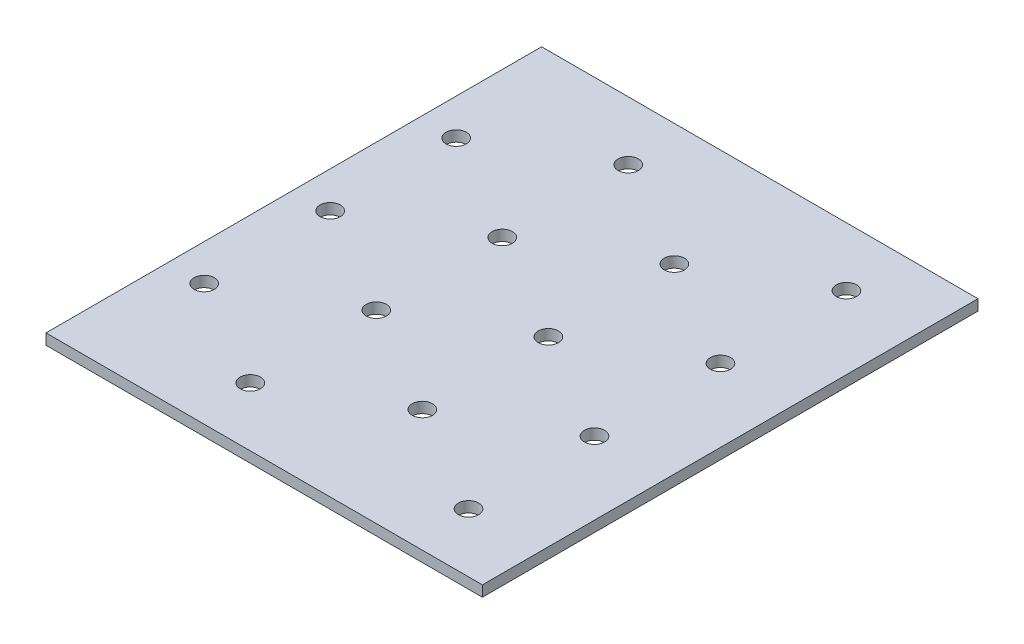
ISO-10303-21;
HEADER;
FILE_DESCRIPTION(('STEP AP214'),'2;1');
FILE_NAME('part.step','',(''),(''),'','','');
FILE_SCHEMA(('AUTOMOTIVE_DESIGN { 1 0 10303 214 1 1 1 1 }'));
ENDSEC;
DATA;
#1=APPLICATION_CONTEXT('core data for automotive mechanical design processes');
#2=APPLICATION_PROTOCOL_DEFINITION('international standard','automotive_design',2000,#1);
#3=PRODUCT_CONTEXT('',#1,'mechanical');
#4=PRODUCT('Part','Part','',(#3));
#5=PRODUCT_RELATED_PRODUCT_CATEGORY('part','',(#4));
#6=PRODUCT_DEFINITION_FORMATION('','',#4);
#7=PRODUCT_DEFINITION_CONTEXT('part definition',#1,'design');
#8=PRODUCT_DEFINITION('design','',#6,#7);
#9=PRODUCT_DEFINITION_SHAPE('','',#8);
#10=(LENGTH_UNIT() NAMED_UNIT(*) SI_UNIT(.MILLI.,.METRE.));
#11=(NAMED_UNIT(*) PLANE_ANGLE_UNIT() SI_UNIT($,.RADIAN.));
#12=(NAMED_UNIT(*) SI_UNIT($,.STERADIAN.) SOLID_ANGLE_UNIT());
#13=UNCERTAINTY_MEASURE_WITH_UNIT(LENGTH_MEASURE(1.E-05),#10,'distance_accuracy_value','');
#14=(GEOMETRIC_REPRESENTATION_CONTEXT(3) GLOBAL_UNCERTAINTY_ASSIGNED_CONTEXT((#13)) GLOBAL_UNIT_ASSIGNED_CONTEXT((#10,
#11,#12)) REPRESENTATION_CONTEXT('',''));
#15=CARTESIAN_POINT('',(0.,0.,0.));
#16=DIRECTION('',(0.,0.,1.));
#17=DIRECTION('',(1.,0.,0.));
#18=AXIS2_PLACEMENT_3D('',#15,#16,#17);
#19=CARTESIAN_POINT('',(0.,3.175,0.));
#20=DIRECTION('',(0.,-1.,0.));
#21=DIRECTION('',(0.,0.,-1.));
#22=AXIS2_PLACEMENT_3D('',#19,#20,#21);
#23=PLANE('',#22);
#24=CARTESIAN_POINT('',(-107.5,3.175,0.));
#25=DIRECTION('',(0.,1.,0.));
#26=DIRECTION('',(0.,0.,1.));
#27=AXIS2_PLACEMENT_3D('',#24,#25,#26);
#28=CIRCLE('',#27,6.00000000000001);
#29=CARTESIAN_POINT('',(-107.5,3.175,6.00000000000001));
#30=VERTEX_POINT('',#29);
#31=EDGE_CURVE('E198',#30,#30,#28,.T.);
#32=ORIENTED_EDGE('',*,*,#31,.F.);
#33=EDGE_LOOP('',(#32));
#34=FACE_BOUND('',#33,.T.);
#35=CARTESIAN_POINT('',(-43.,3.175,37.2390923627309));
#36=DIRECTION('',(0.,1.,0.));
#37=DIRECTION('',(0.,0.,1.));
#38=AXIS2_PLACEMENT_3D('',#35,#36,#37);
#39=CIRCLE('',#38,6.);
#40=CARTESIAN_POINT('',(-43.,3.175,43.2390923627309));
#41=VERTEX_POINT('',#40);
#42=EDGE_CURVE('E192',#41,#41,#39,.T.);
#43=ORIENTED_EDGE('',*,*,#42,.F.);
#44=EDGE_LOOP('',(#43));
#45=FACE_BOUND('',#44,.T.);
#46=CARTESIAN_POINT('',(-43.,3.175,-37.2390923627309));
#47=DIRECTION('',(0.,1.,0.));
#48=DIRECTION('',(0.,0.,1.));
#49=AXIS2_PLACEMENT_3D('',#46,#47,#48);
#50=CIRCLE('',#49,6.);
#51=CARTESIAN_POINT('',(-43.,3.175,-31.2390923627309));
#52=VERTEX_POINT('',#51);
#53=EDGE_CURVE('E186',#52,#52,#50,.T.);
#54=ORIENTED_EDGE('',*,*,#53,.F.);
#55=EDGE_LOOP('',(#54));
#56=FACE_BOUND('',#55,.T.);
#57=CARTESIAN_POINT('',(21.5,3.175,0.));
#58=DIRECTION('',(0.,1.,0.));
#59=DIRECTION('',(0.,0.,1.));
#60=AXIS2_PLACEMENT_3D('',#57,#58,#59);
#61=CIRCLE('',#60,6.);
#62=CARTESIAN_POINT('',(21.5,3.175,6.));
#63=VERTEX_POINT('',#62);
#64=EDGE_CURVE('E174',#63,#63,#61,.T.);
#65=ORIENTED_EDGE('',*,*,#64,.F.);
#66=EDGE_LOOP('',(#65));
#67=FACE_BOUND('',#66,.T.);
#68=CARTESIAN_POINT('',(86.,3.175,37.2390923627309));
#69=DIRECTION('',(0.,1.,0.));
#70=DIRECTION('',(0.,0.,1.));
#71=AXIS2_PLACEMENT_3D('',#68,#69,#70);
#72=CIRCLE('',#71,6.00000000000001);
#73=CARTESIAN_POINT('',(86.,3.175,43.2390923627309));
#74=VERTEX_POINT('',#73);
#75=EDGE_CURVE('E168',#74,#74,#72,.T.);
#76=ORIENTED_EDGE('',*,*,#75,.F.);
#77=EDGE_LOOP('',(#76));
#78=FACE_BOUND('',#77,.T.);
#79=CARTESIAN_POINT('',(-107.5,3.175,-74.4781847254617));
#80=DIRECTION('',(0.,1.,0.));
#81=DIRECTION('',(0.,0.,1.));
#82=AXIS2_PLACEMENT_3D('',#79,#80,#81);
#83=CIRCLE('',#82,6.00000000000001);
#84=CARTESIAN_POINT('',(-107.5,3.175,-68.4781847254617));
#85=VERTEX_POINT('',#84);
#86=EDGE_CURVE('E162',#85,#85,#83,.T.);
#87=ORIENTED_EDGE('',*,*,#86,.F.);
#88=EDGE_LOOP('',(#87));
#89=FACE_BOUND('',#88,.T.);
#90=CARTESIAN_POINT('',(-43.,3.175,-111.717277088193));
#91=DIRECTION('',(0.,1.,0.));
#92=DIRECTION('',(0.,0.,1.));
#93=AXIS2_PLACEMENT_3D('',#90,#91,#92);
#94=CIRCLE('',#93,6.);
#95=CARTESIAN_POINT('',(-43.,3.175,-105.717277088193));
#96=VERTEX_POINT('',#95);
#97=EDGE_CURVE('E156',#96,#96,#94,.T.);
#98=ORIENTED_EDGE('',*,*,#97,.F.);
#99=EDGE_LOOP('',(#98));
#100=FACE_BOUND('',#99,.T.);
#101=CARTESIAN_POINT('',(21.5,3.175,-74.4781847254617));
#102=DIRECTION('',(0.,1.,0.));
#103=DIRECTION('',(0.,0.,1.));
#104=AXIS2_PLACEMENT_3D('',#101,#102,#103);
#105=CIRCLE('',#104,6.);
#106=CARTESIAN_POINT('',(21.5,3.175,-68.4781847254617));
#107=VERTEX_POINT('',#106);
#108=EDGE_CURVE('E150',#107,#107,#105,.T.);
#109=ORIENTED_EDGE('',*,*,#108,.F.);
#110=EDGE_LOOP('',(#109));
#111=FACE_BOUND('',#110,.T.);
#112=CARTESIAN_POINT('',(86.,3.175,-111.717277088193));
#113=DIRECTION('',(0.,1.,0.));
#114=DIRECTION('',(0.,0.,1.));
#115=AXIS2_PLACEMENT_3D('',#112,#113,#114);
#116=CIRCLE('',#115,6.00000000000001);
#117=CARTESIAN_POINT('',(86.,3.175,-105.717277088193));
#118=VERTEX_POINT('',#117);
#119=EDGE_CURVE('E144',#118,#118,#116,.T.);
#120=ORIENTED_EDGE('',*,*,#119,.F.);
#121=EDGE_LOOP('',(#120));
#122=FACE_BOUND('',#121,.T.);
#123=CARTESIAN_POINT('',(-107.5,3.175,74.4781847254617));
#124=DIRECTION('',(0.,1.,0.));
#125=DIRECTION('',(0.,0.,1.));
#126=AXIS2_PLACEMENT_3D('',#123,#124,#125);
#127=CIRCLE('',#126,6.00000000000001);
#128=CARTESIAN_POINT('',(-107.5,3.175,80.4781847254618));
#129=VERTEX_POINT('',#128);
#130=EDGE_CURVE('E138',#129,#129,#127,.T.);
#131=ORIENTED_EDGE('',*,*,#130,.F.);
#132=EDGE_LOOP('',(#131));
#133=FACE_BOUND('',#132,.T.);
#134=CARTESIAN_POINT('',(-43.,3.175,111.717277088193));
#135=DIRECTION('',(0.,1.,0.));
#136=DIRECTION('',(0.,0.,1.));
#137=AXIS2_PLACEMENT_3D('',#134,#135,#136);
#138=CIRCLE('',#137,6.);
#139=CARTESIAN_POINT('',(-43.,3.175,117.717277088193));
#140=VERTEX_POINT('',#139);
#141=EDGE_CURVE('E132',#140,#140,#138,.T.);
#142=ORIENTED_EDGE('',*,*,#141,.F.);
#143=EDGE_LOOP('',(#142));
#144=FACE_BOUND('',#143,.T.);
#145=CARTESIAN_POINT('',(21.5,3.175,74.4781847254617));
#146=DIRECTION('',(0.,1.,0.));
#147=DIRECTION('',(0.,0.,1.));
#148=AXIS2_PLACEMENT_3D('',#145,#146,#147);
#149=CIRCLE('',#148,6.);
#150=CARTESIAN_POINT('',(21.5,3.175,80.4781847254618));
#151=VERTEX_POINT('',#150);
#152=EDGE_CURVE('E126',#151,#151,#149,.T.);
#153=ORIENTED_EDGE('',*,*,#152,.F.);
#154=EDGE_LOOP('',(#153));
#155=FACE_BOUND('',#154,.T.);
#156=CARTESIAN_POINT('',(86.,3.175,111.717277088193));
#157=DIRECTION('',(0.,1.,0.));
#158=DIRECTION('',(0.,0.,1.));
#159=AXIS2_PLACEMENT_3D('',#156,#157,#158);
#160=CIRCLE('',#159,6.00000000000001);
#161=CARTESIAN_POINT('',(86.,3.175,117.717277088193));
#162=VERTEX_POINT('',#161);
#163=EDGE_CURVE('E120',#162,#162,#160,.T.);
#164=ORIENTED_EDGE('',*,*,#163,.F.);
#165=EDGE_LOOP('',(#164));
#166=FACE_BOUND('',#165,.T.);
#167=DIRECTION('',(0.,0.,-1.));
#168=VECTOR('',#167,1.);
#169=CARTESIAN_POINT('',(129.,3.175,146.5));
#170=LINE('',#169,#168);
#171=CARTESIAN_POINT('',(129.,3.175,146.5));
#172=VERTEX_POINT('',#171);
#173=CARTESIAN_POINT('',(129.,3.175,-146.5));
#174=VERTEX_POINT('',#173);
#175=EDGE_CURVE('E91',#172,#174,#170,.T.);
#176=ORIENTED_EDGE('',*,*,#175,.T.);
#177=DIRECTION('',(-1.,0.,0.));
#178=VECTOR('',#177,1.);
#179=CARTESIAN_POINT('',(-129.,3.175,-146.5));
#180=LINE('',#179,#178);
#181=CARTESIAN_POINT('',(-129.,3.175,-146.5));
#182=VERTEX_POINT('',#181);
#183=EDGE_CURVE('E86',#174,#182,#180,.T.);
#184=ORIENTED_EDGE('',*,*,#183,.T.);
#185=DIRECTION('',(0.,0.,1.));
#186=VECTOR('',#185,1.);
#187=CARTESIAN_POINT('',(-129.,3.175,146.5));
#188=LINE('',#187,#186);
#189=CARTESIAN_POINT('',(-129.,3.175,146.5));
#190=VERTEX_POINT('',#189);
#191=EDGE_CURVE('E89',#182,#190,#188,.T.);
#192=ORIENTED_EDGE('',*,*,#191,.T.);
#193=DIRECTION('',(1.,0.,0.));
#194=VECTOR('',#193,1.);
#195=CARTESIAN_POINT('',(-129.,3.175,146.5));
#196=LINE('',#195,#194);
#197=EDGE_CURVE('E56',#190,#172,#196,.T.);
#198=ORIENTED_EDGE('',*,*,#197,.T.);
#199=EDGE_LOOP('',(#176,#184,#192,#198));
#200=FACE_BOUND('',#199,.T.);
#201=CARTESIAN_POINT('',(86.,3.175,-37.2390923627309));
#202=DIRECTION('',(0.,1.,0.));
#203=DIRECTION('',(0.,0.,1.));
#204=AXIS2_PLACEMENT_3D('',#201,#202,#203);
#205=CIRCLE('',#204,6.00000000000001);
#206=CARTESIAN_POINT('',(86.,3.175,-31.2390923627309));
#207=VERTEX_POINT('',#206);
#208=EDGE_CURVE('E180',#207,#207,#205,.T.);
#209=ORIENTED_EDGE('',*,*,#208,.F.);
#210=EDGE_LOOP('',(#209));
#211=FACE_BOUND('',#210,.T.);
#212=ADVANCED_FACE('F39',(#34,#45,#56,#67,#78,#89,#100,#111,#122,#133,#144,#155,#166,#200,#211),
#23,.F.);
#213=CARTESIAN_POINT('',(0.,-3.175,0.));
#214=DIRECTION('',(0.,-1.,0.));
#215=DIRECTION('',(0.,0.,-1.));
#216=AXIS2_PLACEMENT_3D('',#213,#214,#215);
#217=PLANE('',#216);
#218=CARTESIAN_POINT('',(-107.5,-3.175,0.));
#219=DIRECTION('',(0.,1.,0.));
#220=DIRECTION('',(0.,0.,1.));
#221=AXIS2_PLACEMENT_3D('',#218,#219,#220);
#222=CIRCLE('',#221,6.00000000000001);
#223=CARTESIAN_POINT('',(-107.5,-3.175,6.00000000000001));
#224=VERTEX_POINT('',#223);
#225=EDGE_CURVE('E195',#224,#224,#222,.T.);
#226=ORIENTED_EDGE('',*,*,#225,.T.);
#227=EDGE_LOOP('',(#226));
#228=FACE_BOUND('',#227,.T.);
#229=CARTESIAN_POINT('',(-43.,-3.175,37.2390923627309));
#230=DIRECTION('',(0.,1.,0.));
#231=DIRECTION('',(0.,0.,1.));
#232=AXIS2_PLACEMENT_3D('',#229,#230,#231);
#233=CIRCLE('',#232,6.);
#234=CARTESIAN_POINT('',(-43.,-3.175,43.2390923627309));
#235=VERTEX_POINT('',#234);
#236=EDGE_CURVE('E189',#235,#235,#233,.T.);
#237=ORIENTED_EDGE('',*,*,#236,.T.);
#238=EDGE_LOOP('',(#237));
#239=FACE_BOUND('',#238,.T.);
#240=CARTESIAN_POINT('',(-43.,-3.175,-37.2390923627309));
#241=DIRECTION('',(0.,1.,0.));
#242=DIRECTION('',(0.,0.,1.));
#243=AXIS2_PLACEMENT_3D('',#240,#241,#242);
#244=CIRCLE('',#243,6.);
#245=CARTESIAN_POINT('',(-43.,-3.175,-31.2390923627309));
#246=VERTEX_POINT('',#245);
#247=EDGE_CURVE('E183',#246,#246,#244,.T.);
#248=ORIENTED_EDGE('',*,*,#247,.T.);
#249=EDGE_LOOP('',(#248));
#250=FACE_BOUND('',#249,.T.);
#251=CARTESIAN_POINT('',(86.,-3.175,-37.2390923627309));
#252=DIRECTION('',(0.,1.,0.));
#253=DIRECTION('',(0.,0.,1.));
#254=AXIS2_PLACEMENT_3D('',#251,#252,#253);
#255=CIRCLE('',#254,6.00000000000001);
#256=CARTESIAN_POINT('',(86.,-3.175,-31.2390923627309));
#257=VERTEX_POINT('',#256);
#258=EDGE_CURVE('E177',#257,#257,#255,.T.);
#259=ORIENTED_EDGE('',*,*,#258,.T.);
#260=EDGE_LOOP('',(#259));
#261=FACE_BOUND('',#260,.T.);
#262=CARTESIAN_POINT('',(21.5,-3.175,0.));
#263=DIRECTION('',(0.,1.,0.));
#264=DIRECTION('',(0.,0.,1.));
#265=AXIS2_PLACEMENT_3D('',#262,#263,#264);
#266=CIRCLE('',#265,6.);
#267=CARTESIAN_POINT('',(21.5,-3.175,6.));
#268=VERTEX_POINT('',#267);
#269=EDGE_CURVE('E171',#268,#268,#266,.T.);
#270=ORIENTED_EDGE('',*,*,#269,.T.);
#271=EDGE_LOOP('',(#270));
#272=FACE_BOUND('',#271,.T.);
#273=CARTESIAN_POINT('',(86.,-3.175,37.2390923627309));
#274=DIRECTION('',(0.,1.,0.));
#275=DIRECTION('',(0.,0.,1.));
#276=AXIS2_PLACEMENT_3D('',#273,#274,#275);
#277=CIRCLE('',#276,6.00000000000001);
#278=CARTESIAN_POINT('',(86.,-3.175,43.2390923627309));
#279=VERTEX_POINT('',#278);
#280=EDGE_CURVE('E165',#279,#279,#277,.T.);
#281=ORIENTED_EDGE('',*,*,#280,.T.);
#282=EDGE_LOOP('',(#281));
#283=FACE_BOUND('',#282,.T.);
#284=CARTESIAN_POINT('',(-107.5,-3.175,-74.4781847254617));
#285=DIRECTION('',(0.,1.,0.));
#286=DIRECTION('',(0.,0.,1.));
#287=AXIS2_PLACEMENT_3D('',#284,#285,#286);
#288=CIRCLE('',#287,6.00000000000001);
#289=CARTESIAN_POINT('',(-107.5,-3.175,-68.4781847254617));
#290=VERTEX_POINT('',#289);
#291=EDGE_CURVE('E159',#290,#290,#288,.T.);
#292=ORIENTED_EDGE('',*,*,#291,.T.);
#293=EDGE_LOOP('',(#292));
#294=FACE_BOUND('',#293,.T.);
#295=CARTESIAN_POINT('',(-43.,-3.175,-111.717277088193));
#296=DIRECTION('',(0.,1.,0.));
#297=DIRECTION('',(0.,0.,1.));
#298=AXIS2_PLACEMENT_3D('',#295,#296,#297);
#299=CIRCLE('',#298,6.);
#300=CARTESIAN_POINT('',(-43.,-3.175,-105.717277088193));
#301=VERTEX_POINT('',#300);
#302=EDGE_CURVE('E153',#301,#301,#299,.T.);
#303=ORIENTED_EDGE('',*,*,#302,.T.);
#304=EDGE_LOOP('',(#303));
#305=FACE_BOUND('',#304,.T.);
#306=CARTESIAN_POINT('',(21.5,-3.175,-74.4781847254617));
#307=DIRECTION('',(0.,1.,0.));
#308=DIRECTION('',(0.,0.,1.));
#309=AXIS2_PLACEMENT_3D('',#306,#307,#308);
#310=CIRCLE('',#309,6.);
#311=CARTESIAN_POINT('',(21.5,-3.175,-68.4781847254617));
#312=VERTEX_POINT('',#311);
#313=EDGE_CURVE('E147',#312,#312,#310,.T.);
#314=ORIENTED_EDGE('',*,*,#313,.T.);
#315=EDGE_LOOP('',(#314));
#316=FACE_BOUND('',#315,.T.);
#317=CARTESIAN_POINT('',(86.,-3.175,-111.717277088193));
#318=DIRECTION('',(0.,1.,0.));
#319=DIRECTION('',(0.,0.,1.));
#320=AXIS2_PLACEMENT_3D('',#317,#318,#319);
#321=CIRCLE('',#320,5.99999999999999);
#322=CARTESIAN_POINT('',(86.,-3.175,-105.717277088193));
#323=VERTEX_POINT('',#322);
#324=EDGE_CURVE('E141',#323,#323,#321,.T.);
#325=ORIENTED_EDGE('',*,*,#324,.T.);
#326=EDGE_LOOP('',(#325));
#327=FACE_BOUND('',#326,.T.);
#328=CARTESIAN_POINT('',(-107.5,-3.175,74.4781847254617));
#329=DIRECTION('',(0.,1.,0.));
#330=DIRECTION('',(0.,0.,1.));
#331=AXIS2_PLACEMENT_3D('',#328,#329,#330);
#332=CIRCLE('',#331,6.00000000000001);
#333=CARTESIAN_POINT('',(-107.5,-3.175,80.4781847254618));
#334=VERTEX_POINT('',#333);
#335=EDGE_CURVE('E135',#334,#334,#332,.T.);
#336=ORIENTED_EDGE('',*,*,#335,.T.);
#337=EDGE_LOOP('',(#336));
#338=FACE_BOUND('',#337,.T.);
#339=CARTESIAN_POINT('',(-43.,-3.175,111.717277088193));
#340=DIRECTION('',(0.,1.,0.));
#341=DIRECTION('',(0.,0.,1.));
#342=AXIS2_PLACEMENT_3D('',#339,#340,#341);
#343=CIRCLE('',#342,6.);
#344=CARTESIAN_POINT('',(-43.,-3.175,117.717277088193));
#345=VERTEX_POINT('',#344);
#346=EDGE_CURVE('E129',#345,#345,#343,.T.);
#347=ORIENTED_EDGE('',*,*,#346,.T.);
#348=EDGE_LOOP('',(#347));
#349=FACE_BOUND('',#348,.T.);
#350=CARTESIAN_POINT('',(21.5,-3.175,74.4781847254617));
#351=DIRECTION('',(0.,1.,0.));
#352=DIRECTION('',(0.,0.,1.));
#353=AXIS2_PLACEMENT_3D('',#350,#351,#352);
#354=CIRCLE('',#353,6.);
#355=CARTESIAN_POINT('',(21.5,-3.175,80.4781847254618));
#356=VERTEX_POINT('',#355);
#357=EDGE_CURVE('E123',#356,#356,#354,.T.);
#358=ORIENTED_EDGE('',*,*,#357,.T.);
#359=EDGE_LOOP('',(#358));
#360=FACE_BOUND('',#359,.T.);
#361=DIRECTION('',(0.,0.,-1.));
#362=VECTOR('',#361,1.);
#363=CARTESIAN_POINT('',(129.,-3.175,146.5));
#364=LINE('',#363,#362);
#365=CARTESIAN_POINT('',(129.,-3.175,146.5));
#366=VERTEX_POINT('',#365);
#367=CARTESIAN_POINT('',(129.,-3.175,-146.5));
#368=VERTEX_POINT('',#367);
#369=EDGE_CURVE('E103',#366,#368,#364,.T.);
#370=ORIENTED_EDGE('',*,*,#369,.F.);
#371=DIRECTION('',(1.,0.,0.));
#372=VECTOR('',#371,1.);
#373=CARTESIAN_POINT('',(-129.,-3.175,146.5));
#374=LINE('',#373,#372);
#375=CARTESIAN_POINT('',(-129.,-3.175,146.5));
#376=VERTEX_POINT('',#375);
#377=EDGE_CURVE('E79',#376,#366,#374,.T.);
#378=ORIENTED_EDGE('',*,*,#377,.F.);
#379=DIRECTION('',(0.,0.,1.));
#380=VECTOR('',#379,1.);
#381=CARTESIAN_POINT('',(-129.,-3.175,146.5));
#382=LINE('',#381,#380);
#383=CARTESIAN_POINT('',(-129.,-3.175,-146.5));
#384=VERTEX_POINT('',#383);
#385=EDGE_CURVE('E73',#384,#376,#382,.T.);
#386=ORIENTED_EDGE('',*,*,#385,.F.);
#387=DIRECTION('',(-1.,0.,0.));
#388=VECTOR('',#387,1.);
#389=CARTESIAN_POINT('',(-129.,-3.175,-146.5));
#390=LINE('',#389,#388);
#391=EDGE_CURVE('E95',#368,#384,#390,.T.);
#392=ORIENTED_EDGE('',*,*,#391,.F.);
#393=EDGE_LOOP('',(#370,#378,#386,#392));
#394=FACE_BOUND('',#393,.T.);
#395=CARTESIAN_POINT('',(86.,-3.175,111.717277088193));
#396=DIRECTION('',(0.,1.,0.));
#397=DIRECTION('',(0.,0.,1.));
#398=AXIS2_PLACEMENT_3D('',#395,#396,#397);
#399=CIRCLE('',#398,5.99999999999999);
#400=CARTESIAN_POINT('',(86.,-3.175,117.717277088193));
#401=VERTEX_POINT('',#400);
#402=EDGE_CURVE('E106',#401,#401,#399,.T.);
#403=ORIENTED_EDGE('',*,*,#402,.T.);
#404=EDGE_LOOP('',(#403));
#405=FACE_BOUND('',#404,.T.);
#406=ADVANCED_FACE('F114',(#228,#239,#250,#261,#272,#283,#294,#305,#316,#327,#338,#349,#360,
#394,#405),#217,.T.);
#407=CARTESIAN_POINT('',(129.,3.175,146.5));
#408=DIRECTION('',(-1.,0.,0.));
#409=DIRECTION('',(0.,0.,1.));
#410=AXIS2_PLACEMENT_3D('',#407,#408,#409);
#411=PLANE('',#410);
#412=ORIENTED_EDGE('',*,*,#369,.T.);
#413=DIRECTION('',(0.,-1.,0.));
#414=VECTOR('',#413,1.);
#415=CARTESIAN_POINT('',(129.,3.175,-146.5));
#416=LINE('',#415,#414);
#417=EDGE_CURVE('E11',#174,#368,#416,.T.);
#418=ORIENTED_EDGE('',*,*,#417,.F.);
#419=ORIENTED_EDGE('',*,*,#175,.F.);
#420=DIRECTION('',(0.,-1.,0.));
#421=VECTOR('',#420,1.);
#422=CARTESIAN_POINT('',(129.,3.175,146.5));
#423=LINE('',#422,#421);
#424=EDGE_CURVE('E99',#172,#366,#423,.T.);
#425=ORIENTED_EDGE('',*,*,#424,.T.);
#426=EDGE_LOOP('',(#412,#418,#419,#425));
#427=FACE_BOUND('',#426,.T.);
#428=ADVANCED_FACE('F41',(#427),#411,.F.);
#429=CARTESIAN_POINT('',(-129.,3.175,-146.5));
#430=DIRECTION('',(0.,0.,1.));
#431=DIRECTION('',(1.,0.,0.));
#432=AXIS2_PLACEMENT_3D('',#429,#430,#431);
#433=PLANE('',#432);
#434=ORIENTED_EDGE('',*,*,#391,.T.);
#435=DIRECTION('',(0.,-1.,0.));
#436=VECTOR('',#435,1.);
#437=CARTESIAN_POINT('',(-129.,3.175,-146.5));
#438=LINE('',#437,#436);
#439=EDGE_CURVE('E48',#182,#384,#438,.T.);
#440=ORIENTED_EDGE('',*,*,#439,.F.);
#441=ORIENTED_EDGE('',*,*,#183,.F.);
#442=ORIENTED_EDGE('',*,*,#417,.T.);
#443=EDGE_LOOP('',(#434,#440,#441,#442));
#444=FACE_BOUND('',#443,.T.);
#445=ADVANCED_FACE('F94',(#444),#433,.F.);
#446=CARTESIAN_POINT('',(-129.,3.175,146.5));
#447=DIRECTION('',(1.,0.,0.));
#448=DIRECTION('',(0.,0.,-1.));
#449=AXIS2_PLACEMENT_3D('',#446,#447,#448);
#450=PLANE('',#449);
#451=ORIENTED_EDGE('',*,*,#385,.T.);
#452=DIRECTION('',(0.,-1.,0.));
#453=VECTOR('',#452,1.);
#454=CARTESIAN_POINT('',(-129.,3.175,146.5));
#455=LINE('',#454,#453);
#456=EDGE_CURVE('E96',#190,#376,#455,.T.);
#457=ORIENTED_EDGE('',*,*,#456,.F.);
#458=ORIENTED_EDGE('',*,*,#191,.F.);
#459=ORIENTED_EDGE('',*,*,#439,.T.);
#460=EDGE_LOOP('',(#451,#457,#458,#459));
#461=FACE_BOUND('',#460,.T.);
#462=ADVANCED_FACE('F97',(#461),#450,.F.);
#463=CARTESIAN_POINT('',(-129.,3.175,146.5));
#464=DIRECTION('',(0.,0.,-1.));
#465=DIRECTION('',(-1.,0.,0.));
#466=AXIS2_PLACEMENT_3D('',#463,#464,#465);
#467=PLANE('',#466);
#468=ORIENTED_EDGE('',*,*,#377,.T.);
#469=ORIENTED_EDGE('',*,*,#424,.F.);
#470=ORIENTED_EDGE('',*,*,#197,.F.);
#471=ORIENTED_EDGE('',*,*,#456,.T.);
#472=EDGE_LOOP('',(#468,#469,#470,#471));
#473=FACE_BOUND('',#472,.T.);
#474=ADVANCED_FACE('F111',(#473),#467,.F.);
#475=CARTESIAN_POINT('',(86.,3.175,111.717277088193));
#476=DIRECTION('',(0.,1.,0.));
#477=DIRECTION('',(0.,0.,1.));
#478=AXIS2_PLACEMENT_3D('',#475,#476,#477);
#479=CYLINDRICAL_SURFACE('',#478,6.);
#480=ORIENTED_EDGE('',*,*,#402,.F.);
#481=EDGE_LOOP('',(#480));
#482=FACE_BOUND('',#481,.T.);
#483=ORIENTED_EDGE('',*,*,#163,.T.);
#484=EDGE_LOOP('',(#483));
#485=FACE_BOUND('',#484,.T.);
#486=ADVANCED_FACE('F231',(#482,#485),#479,.F.);
#487=CARTESIAN_POINT('',(21.5,3.175,74.4781847254617));
#488=DIRECTION('',(0.,1.,0.));
#489=DIRECTION('',(0.,0.,1.));
#490=AXIS2_PLACEMENT_3D('',#487,#488,#489);
#491=CYLINDRICAL_SURFACE('',#490,6.);
#492=ORIENTED_EDGE('',*,*,#357,.F.);
#493=EDGE_LOOP('',(#492));
#494=FACE_BOUND('',#493,.T.);
#495=ORIENTED_EDGE('',*,*,#152,.T.);
#496=EDGE_LOOP('',(#495));
#497=FACE_BOUND('',#496,.T.);
#498=ADVANCED_FACE('F233',(#494,#497),#491,.F.);
#499=CARTESIAN_POINT('',(-43.,3.175,111.717277088193));
#500=DIRECTION('',(0.,1.,0.));
#501=DIRECTION('',(0.,0.,1.));
#502=AXIS2_PLACEMENT_3D('',#499,#500,#501);
#503=CYLINDRICAL_SURFACE('',#502,6.);
#504=ORIENTED_EDGE('',*,*,#346,.F.);
#505=EDGE_LOOP('',(#504));
#506=FACE_BOUND('',#505,.T.);
#507=ORIENTED_EDGE('',*,*,#141,.T.);
#508=EDGE_LOOP('',(#507));
#509=FACE_BOUND('',#508,.T.);
#510=ADVANCED_FACE('F240',(#506,#509),#503,.F.);
#511=CARTESIAN_POINT('',(-107.5,3.175,74.4781847254617));
#512=DIRECTION('',(0.,1.,0.));
#513=DIRECTION('',(0.,0.,1.));
#514=AXIS2_PLACEMENT_3D('',#511,#512,#513);
#515=CYLINDRICAL_SURFACE('',#514,6.00000000000001);
#516=ORIENTED_EDGE('',*,*,#335,.F.);
#517=EDGE_LOOP('',(#516));
#518=FACE_BOUND('',#517,.T.);
#519=ORIENTED_EDGE('',*,*,#130,.T.);
#520=EDGE_LOOP('',(#519));
#521=FACE_BOUND('',#520,.T.);
#522=ADVANCED_FACE('F303',(#518,#521),#515,.F.);
#523=CARTESIAN_POINT('',(86.,3.175,-111.717277088193));
#524=DIRECTION('',(0.,1.,0.));
#525=DIRECTION('',(0.,0.,1.));
#526=AXIS2_PLACEMENT_3D('',#523,#524,#525);
#527=CYLINDRICAL_SURFACE('',#526,6.);
#528=ORIENTED_EDGE('',*,*,#324,.F.);
#529=EDGE_LOOP('',(#528));
#530=FACE_BOUND('',#529,.T.);
#531=ORIENTED_EDGE('',*,*,#119,.T.);
#532=EDGE_LOOP('',(#531));
#533=FACE_BOUND('',#532,.T.);
#534=ADVANCED_FACE('F312',(#530,#533),#527,.F.);
#535=CARTESIAN_POINT('',(21.5,3.175,-74.4781847254617));
#536=DIRECTION('',(0.,1.,0.));
#537=DIRECTION('',(0.,0.,1.));
#538=AXIS2_PLACEMENT_3D('',#535,#536,#537);
#539=CYLINDRICAL_SURFACE('',#538,6.);
#540=ORIENTED_EDGE('',*,*,#313,.F.);
#541=EDGE_LOOP('',(#540));
#542=FACE_BOUND('',#541,.T.);
#543=ORIENTED_EDGE('',*,*,#108,.T.);
#544=EDGE_LOOP('',(#543));
#545=FACE_BOUND('',#544,.T.);
#546=ADVANCED_FACE('F322',(#542,#545),#539,.F.);
#547=CARTESIAN_POINT('',(-43.,3.175,-111.717277088193));
#548=DIRECTION('',(0.,1.,0.));
#549=DIRECTION('',(0.,0.,1.));
#550=AXIS2_PLACEMENT_3D('',#547,#548,#549);
#551=CYLINDRICAL_SURFACE('',#550,6.);
#552=ORIENTED_EDGE('',*,*,#302,.F.);
#553=EDGE_LOOP('',(#552));
#554=FACE_BOUND('',#553,.T.);
#555=ORIENTED_EDGE('',*,*,#97,.T.);
#556=EDGE_LOOP('',(#555));
#557=FACE_BOUND('',#556,.T.);
#558=ADVANCED_FACE('F332',(#554,#557),#551,.F.);
#559=CARTESIAN_POINT('',(-107.5,3.175,-74.4781847254617));
#560=DIRECTION('',(0.,1.,0.));
#561=DIRECTION('',(0.,0.,1.));
#562=AXIS2_PLACEMENT_3D('',#559,#560,#561);
#563=CYLINDRICAL_SURFACE('',#562,6.00000000000001);
#564=ORIENTED_EDGE('',*,*,#291,.F.);
#565=EDGE_LOOP('',(#564));
#566=FACE_BOUND('',#565,.T.);
#567=ORIENTED_EDGE('',*,*,#86,.T.);
#568=EDGE_LOOP('',(#567));
#569=FACE_BOUND('',#568,.T.);
#570=ADVANCED_FACE('F342',(#566,#569),#563,.F.);
#571=CARTESIAN_POINT('',(86.,3.175,37.2390923627309));
#572=DIRECTION('',(0.,1.,0.));
#573=DIRECTION('',(0.,0.,1.));
#574=AXIS2_PLACEMENT_3D('',#571,#572,#573);
#575=CYLINDRICAL_SURFACE('',#574,6.00000000000001);
#576=ORIENTED_EDGE('',*,*,#280,.F.);
#577=EDGE_LOOP('',(#576));
#578=FACE_BOUND('',#577,.T.);
#579=ORIENTED_EDGE('',*,*,#75,.T.);
#580=EDGE_LOOP('',(#579));
#581=FACE_BOUND('',#580,.T.);
#582=ADVANCED_FACE('F352',(#578,#581),#575,.F.);
#583=CARTESIAN_POINT('',(21.5,3.175,0.));
#584=DIRECTION('',(0.,1.,0.));
#585=DIRECTION('',(0.,0.,1.));
#586=AXIS2_PLACEMENT_3D('',#583,#584,#585);
#587=CYLINDRICAL_SURFACE('',#586,6.);
#588=ORIENTED_EDGE('',*,*,#269,.F.);
#589=EDGE_LOOP('',(#588));
#590=FACE_BOUND('',#589,.T.);
#591=ORIENTED_EDGE('',*,*,#64,.T.);
#592=EDGE_LOOP('',(#591));
#593=FACE_BOUND('',#592,.T.);
#594=ADVANCED_FACE('F362',(#590,#593),#587,.F.);
#595=CARTESIAN_POINT('',(86.,3.175,-37.2390923627309));
#596=DIRECTION('',(0.,1.,0.));
#597=DIRECTION('',(0.,0.,1.));
#598=AXIS2_PLACEMENT_3D('',#595,#596,#597);
#599=CYLINDRICAL_SURFACE('',#598,6.00000000000001);
#600=ORIENTED_EDGE('',*,*,#258,.F.);
#601=EDGE_LOOP('',(#600));
#602=FACE_BOUND('',#601,.T.);
#603=ORIENTED_EDGE('',*,*,#208,.T.);
#604=EDGE_LOOP('',(#603));
#605=FACE_BOUND('',#604,.T.);
#606=ADVANCED_FACE('F372',(#602,#605),#599,.F.);
#607=CARTESIAN_POINT('',(-43.,3.175,-37.2390923627309));
#608=DIRECTION('',(0.,1.,0.));
#609=DIRECTION('',(0.,0.,1.));
#610=AXIS2_PLACEMENT_3D('',#607,#608,#609);
#611=CYLINDRICAL_SURFACE('',#610,6.);
#612=ORIENTED_EDGE('',*,*,#247,.F.);
#613=EDGE_LOOP('',(#612));
#614=FACE_BOUND('',#613,.T.);
#615=ORIENTED_EDGE('',*,*,#53,.T.);
#616=EDGE_LOOP('',(#615));
#617=FACE_BOUND('',#616,.T.);
#618=ADVANCED_FACE('F382',(#614,#617),#611,.F.);
#619=CARTESIAN_POINT('',(-43.,3.175,37.2390923627309));
#620=DIRECTION('',(0.,1.,0.));
#621=DIRECTION('',(0.,0.,1.));
#622=AXIS2_PLACEMENT_3D('',#619,#620,#621);
#623=CYLINDRICAL_SURFACE('',#622,6.);
#624=ORIENTED_EDGE('',*,*,#236,.F.);
#625=EDGE_LOOP('',(#624));
#626=FACE_BOUND('',#625,.T.);
#627=ORIENTED_EDGE('',*,*,#42,.T.);
#628=EDGE_LOOP('',(#627));
#629=FACE_BOUND('',#628,.T.);
#630=ADVANCED_FACE('F392',(#626,#629),#623,.F.);
#631=CARTESIAN_POINT('',(-107.5,3.175,0.));
#632=DIRECTION('',(0.,1.,0.));
#633=DIRECTION('',(0.,0.,1.));
#634=AXIS2_PLACEMENT_3D('',#631,#632,#633);
#635=CYLINDRICAL_SURFACE('',#634,6.00000000000001);
#636=ORIENTED_EDGE('',*,*,#225,.F.);
#637=EDGE_LOOP('',(#636));
#638=FACE_BOUND('',#637,.T.);
#639=ORIENTED_EDGE('',*,*,#31,.T.);
#640=EDGE_LOOP('',(#639));
#641=FACE_BOUND('',#640,.T.);
#642=ADVANCED_FACE('F202',(#638,#641),#635,.F.);
#643=CLOSED_SHELL('',(#212,#406,#428,#445,#462,#474,#486,#498,#510,#522,#534,#546,#558,#570,
#582,#594,#606,#618,#630,#642));
#644=MANIFOLD_SOLID_BREP('B2',#643);
#645=ADVANCED_BREP_SHAPE_REPRESENTATION('',(#18,#644),#14);
#646=SHAPE_DEFINITION_REPRESENTATION(#9,#645);
ENDSEC;
END-ISO-10303-21;
